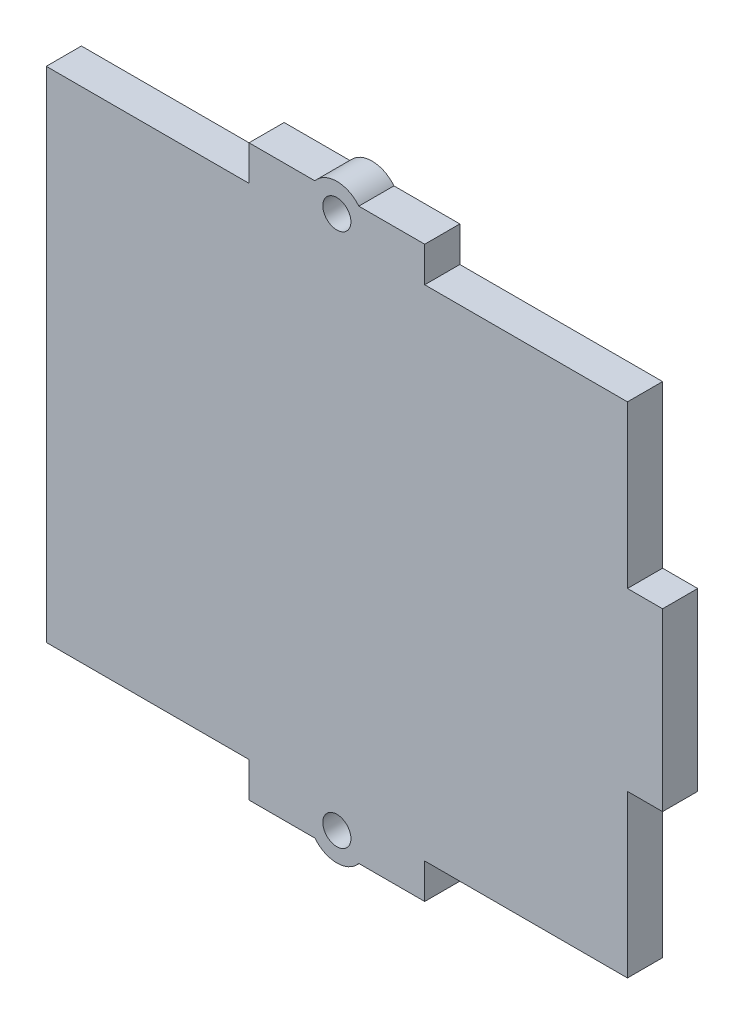
ISO-10303-21;
HEADER;
FILE_DESCRIPTION(('STEP AP214'),'2;1');
FILE_NAME('part.step','',(''),(''),'','','');
FILE_SCHEMA(('AUTOMOTIVE_DESIGN { 1 0 10303 214 1 1 1 1 }'));
ENDSEC;
DATA;
#1=APPLICATION_CONTEXT('core data for automotive mechanical design processes');
#2=APPLICATION_PROTOCOL_DEFINITION('international standard','automotive_design',2000,#1);
#3=PRODUCT_CONTEXT('',#1,'mechanical');
#4=PRODUCT('Part','Part','',(#3));
#5=PRODUCT_RELATED_PRODUCT_CATEGORY('part','',(#4));
#6=PRODUCT_DEFINITION_FORMATION('','',#4);
#7=PRODUCT_DEFINITION_CONTEXT('part definition',#1,'design');
#8=PRODUCT_DEFINITION('design','',#6,#7);
#9=PRODUCT_DEFINITION_SHAPE('','',#8);
#10=(LENGTH_UNIT() NAMED_UNIT(*) SI_UNIT(.MILLI.,.METRE.));
#11=(NAMED_UNIT(*) PLANE_ANGLE_UNIT() SI_UNIT($,.RADIAN.));
#12=(NAMED_UNIT(*) SI_UNIT($,.STERADIAN.) SOLID_ANGLE_UNIT());
#13=UNCERTAINTY_MEASURE_WITH_UNIT(LENGTH_MEASURE(1.E-05),#10,'distance_accuracy_value','');
#14=(GEOMETRIC_REPRESENTATION_CONTEXT(3) GLOBAL_UNCERTAINTY_ASSIGNED_CONTEXT((#13)) GLOBAL_UNIT_ASSIGNED_CONTEXT((#10,
#11,#12)) REPRESENTATION_CONTEXT('',''));
#15=CARTESIAN_POINT('',(0.,0.,0.));
#16=DIRECTION('',(0.,0.,1.));
#17=DIRECTION('',(1.,0.,0.));
#18=AXIS2_PLACEMENT_3D('',#15,#16,#17);
#19=CARTESIAN_POINT('',(12.5,-40.5,0.));
#20=DIRECTION('',(0.,-1.,0.));
#21=DIRECTION('',(0.,0.,-1.));
#22=AXIS2_PLACEMENT_3D('',#19,#20,#21);
#23=PLANE('',#22);
#24=DIRECTION('',(0.,0.,1.));
#25=VECTOR('',#24,1.);
#26=CARTESIAN_POINT('',(3.1224989991992,-40.5,0.));
#27=LINE('',#26,#25);
#28=CARTESIAN_POINT('',(3.1224989991992,-40.5,0.));
#29=VERTEX_POINT('',#28);
#30=CARTESIAN_POINT('',(3.1224989991992,-40.5,5.));
#31=VERTEX_POINT('',#30);
#32=EDGE_CURVE('E11',#29,#31,#27,.T.);
#33=ORIENTED_EDGE('',*,*,#32,.F.);
#34=DIRECTION('',(1.,0.,0.));
#35=VECTOR('',#34,1.);
#36=CARTESIAN_POINT('',(12.5,-40.5,0.));
#37=LINE('',#36,#35);
#38=CARTESIAN_POINT('',(12.5,-40.5,0.));
#39=VERTEX_POINT('',#38);
#40=EDGE_CURVE('E335',#29,#39,#37,.T.);
#41=ORIENTED_EDGE('',*,*,#40,.T.);
#42=DIRECTION('',(0.,0.,1.));
#43=VECTOR('',#42,1.);
#44=CARTESIAN_POINT('',(12.5,-40.5,0.));
#45=LINE('',#44,#43);
#46=CARTESIAN_POINT('',(12.5,-40.5,5.));
#47=VERTEX_POINT('',#46);
#48=EDGE_CURVE('E195',#39,#47,#45,.T.);
#49=ORIENTED_EDGE('',*,*,#48,.T.);
#50=DIRECTION('',(1.,0.,0.));
#51=VECTOR('',#50,1.);
#52=CARTESIAN_POINT('',(12.5,-40.5,5.));
#53=LINE('',#52,#51);
#54=EDGE_CURVE('E188',#31,#47,#53,.T.);
#55=ORIENTED_EDGE('',*,*,#54,.F.);
#56=EDGE_LOOP('',(#33,#41,#49,#55));
#57=FACE_BOUND('',#56,.T.);
#58=ADVANCED_FACE('F34',(#57),#23,.T.);
#59=CARTESIAN_POINT('',(-12.5,40.5,0.));
#60=DIRECTION('',(0.,1.,0.));
#61=DIRECTION('',(-1.,0.,0.));
#62=AXIS2_PLACEMENT_3D('',#59,#60,#61);
#63=PLANE('',#62);
#64=DIRECTION('',(0.,0.,1.));
#65=VECTOR('',#64,1.);
#66=CARTESIAN_POINT('',(-3.12249899919921,40.5,0.));
#67=LINE('',#66,#65);
#68=CARTESIAN_POINT('',(-3.12249899919921,40.5,0.));
#69=VERTEX_POINT('',#68);
#70=CARTESIAN_POINT('',(-3.12249899919921,40.5,5.));
#71=VERTEX_POINT('',#70);
#72=EDGE_CURVE('E181',#69,#71,#67,.T.);
#73=ORIENTED_EDGE('',*,*,#72,.F.);
#74=DIRECTION('',(-1.,0.,0.));
#75=VECTOR('',#74,1.);
#76=CARTESIAN_POINT('',(-12.5,40.5,0.));
#77=LINE('',#76,#75);
#78=CARTESIAN_POINT('',(-12.5,40.5,0.));
#79=VERTEX_POINT('',#78);
#80=EDGE_CURVE('E238',#69,#79,#77,.T.);
#81=ORIENTED_EDGE('',*,*,#80,.T.);
#82=DIRECTION('',(0.,0.,1.));
#83=VECTOR('',#82,1.);
#84=CARTESIAN_POINT('',(-12.5,40.5,0.));
#85=LINE('',#84,#83);
#86=CARTESIAN_POINT('',(-12.5,40.5,5.));
#87=VERTEX_POINT('',#86);
#88=EDGE_CURVE('E250',#79,#87,#85,.T.);
#89=ORIENTED_EDGE('',*,*,#88,.T.);
#90=DIRECTION('',(-1.,0.,0.));
#91=VECTOR('',#90,1.);
#92=CARTESIAN_POINT('',(-12.5,40.5,5.));
#93=LINE('',#92,#91);
#94=EDGE_CURVE('E248',#71,#87,#93,.T.);
#95=ORIENTED_EDGE('',*,*,#94,.F.);
#96=EDGE_LOOP('',(#73,#81,#89,#95));
#97=FACE_BOUND('',#96,.T.);
#98=ADVANCED_FACE('F311',(#97),#63,.T.);
#99=CARTESIAN_POINT('',(-41.35,-35.5,5.));
#100=DIRECTION('',(0.,1.,0.));
#101=DIRECTION('',(0.,0.,1.));
#102=AXIS2_PLACEMENT_3D('',#99,#100,#101);
#103=PLANE('',#102);
#104=DIRECTION('',(0.,0.,1.));
#105=VECTOR('',#104,1.);
#106=CARTESIAN_POINT('',(12.5,-35.5,0.));
#107=LINE('',#106,#105);
#108=CARTESIAN_POINT('',(12.5,-35.5,0.));
#109=VERTEX_POINT('',#108);
#110=CARTESIAN_POINT('',(12.5,-35.5,5.));
#111=VERTEX_POINT('',#110);
#112=EDGE_CURVE('E204',#109,#111,#107,.T.);
#113=ORIENTED_EDGE('',*,*,#112,.F.);
#114=DIRECTION('',(1.,0.,0.));
#115=VECTOR('',#114,1.);
#116=CARTESIAN_POINT('',(-41.35,-35.5,0.));
#117=LINE('',#116,#115);
#118=CARTESIAN_POINT('',(41.35,-35.5,0.));
#119=VERTEX_POINT('',#118);
#120=EDGE_CURVE('E278',#109,#119,#117,.T.);
#121=ORIENTED_EDGE('',*,*,#120,.T.);
#122=DIRECTION('',(0.,0.,-1.));
#123=VECTOR('',#122,1.);
#124=CARTESIAN_POINT('',(41.35,-35.5,5.));
#125=LINE('',#124,#123);
#126=CARTESIAN_POINT('',(41.35,-35.5,5.));
#127=VERTEX_POINT('',#126);
#128=EDGE_CURVE('E294',#127,#119,#125,.T.);
#129=ORIENTED_EDGE('',*,*,#128,.F.);
#130=DIRECTION('',(1.,0.,0.));
#131=VECTOR('',#130,1.);
#132=CARTESIAN_POINT('',(-41.35,-35.5,5.));
#133=LINE('',#132,#131);
#134=EDGE_CURVE('E263',#111,#127,#133,.T.);
#135=ORIENTED_EDGE('',*,*,#134,.F.);
#136=EDGE_LOOP('',(#113,#121,#129,#135));
#137=FACE_BOUND('',#136,.T.);
#138=ADVANCED_FACE('F369',(#137),#103,.F.);
#139=CARTESIAN_POINT('',(41.35,35.5,5.));
#140=DIRECTION('',(-1.,0.,0.));
#141=DIRECTION('',(0.,-1.,0.));
#142=AXIS2_PLACEMENT_3D('',#139,#140,#141);
#143=PLANE('',#142);
#144=DIRECTION('',(0.,0.,1.));
#145=VECTOR('',#144,1.);
#146=CARTESIAN_POINT('',(41.35,12.5,0.));
#147=LINE('',#146,#145);
#148=CARTESIAN_POINT('',(41.35,12.5,0.));
#149=VERTEX_POINT('',#148);
#150=CARTESIAN_POINT('',(41.35,12.5,5.));
#151=VERTEX_POINT('',#150);
#152=EDGE_CURVE('E223',#149,#151,#147,.T.);
#153=ORIENTED_EDGE('',*,*,#152,.F.);
#154=DIRECTION('',(0.,1.,0.));
#155=VECTOR('',#154,1.);
#156=CARTESIAN_POINT('',(41.35,35.5,0.));
#157=LINE('',#156,#155);
#158=CARTESIAN_POINT('',(41.35,35.5,0.));
#159=VERTEX_POINT('',#158);
#160=EDGE_CURVE('E282',#149,#159,#157,.T.);
#161=ORIENTED_EDGE('',*,*,#160,.T.);
#162=DIRECTION('',(0.,0.,-1.));
#163=VECTOR('',#162,1.);
#164=CARTESIAN_POINT('',(41.35,35.5,5.));
#165=LINE('',#164,#163);
#166=CARTESIAN_POINT('',(41.35,35.5,5.));
#167=VERTEX_POINT('',#166);
#168=EDGE_CURVE('E291',#167,#159,#165,.T.);
#169=ORIENTED_EDGE('',*,*,#168,.F.);
#170=DIRECTION('',(0.,1.,0.));
#171=VECTOR('',#170,1.);
#172=CARTESIAN_POINT('',(41.35,35.5,5.));
#173=LINE('',#172,#171);
#174=EDGE_CURVE('E267',#151,#167,#173,.T.);
#175=ORIENTED_EDGE('',*,*,#174,.F.);
#176=EDGE_LOOP('',(#153,#161,#169,#175));
#177=FACE_BOUND('',#176,.T.);
#178=ADVANCED_FACE('F389',(#177),#143,.F.);
#179=CARTESIAN_POINT('',(-41.35,35.5,5.));
#180=DIRECTION('',(0.,-1.,0.));
#181=DIRECTION('',(1.,0.,0.));
#182=AXIS2_PLACEMENT_3D('',#179,#180,#181);
#183=PLANE('',#182);
#184=DIRECTION('',(0.,0.,1.));
#185=VECTOR('',#184,1.);
#186=CARTESIAN_POINT('',(-12.5,35.5,0.));
#187=LINE('',#186,#185);
#188=CARTESIAN_POINT('',(-12.5,35.5,0.));
#189=VERTEX_POINT('',#188);
#190=CARTESIAN_POINT('',(-12.5,35.5,5.));
#191=VERTEX_POINT('',#190);
#192=EDGE_CURVE('E242',#189,#191,#187,.T.);
#193=ORIENTED_EDGE('',*,*,#192,.F.);
#194=DIRECTION('',(-1.,0.,0.));
#195=VECTOR('',#194,1.);
#196=CARTESIAN_POINT('',(-41.35,35.5,0.));
#197=LINE('',#196,#195);
#198=CARTESIAN_POINT('',(-41.35,35.5,0.));
#199=VERTEX_POINT('',#198);
#200=EDGE_CURVE('E286',#189,#199,#197,.T.);
#201=ORIENTED_EDGE('',*,*,#200,.T.);
#202=DIRECTION('',(0.,0.,-1.));
#203=VECTOR('',#202,1.);
#204=CARTESIAN_POINT('',(-41.35,35.5,5.));
#205=LINE('',#204,#203);
#206=CARTESIAN_POINT('',(-41.35,35.5,5.));
#207=VERTEX_POINT('',#206);
#208=EDGE_CURVE('E275',#207,#199,#205,.T.);
#209=ORIENTED_EDGE('',*,*,#208,.F.);
#210=DIRECTION('',(-1.,0.,0.));
#211=VECTOR('',#210,1.);
#212=CARTESIAN_POINT('',(-41.35,35.5,5.));
#213=LINE('',#212,#211);
#214=EDGE_CURVE('E271',#191,#207,#213,.T.);
#215=ORIENTED_EDGE('',*,*,#214,.F.);
#216=EDGE_LOOP('',(#193,#201,#209,#215));
#217=FACE_BOUND('',#216,.T.);
#218=ADVANCED_FACE('F319',(#217),#183,.F.);
#219=CARTESIAN_POINT('',(-41.35,35.5,5.));
#220=DIRECTION('',(1.,0.,0.));
#221=DIRECTION('',(0.,1.,0.));
#222=AXIS2_PLACEMENT_3D('',#219,#220,#221);
#223=PLANE('',#222);
#224=DIRECTION('',(0.,-1.,0.));
#225=VECTOR('',#224,1.);
#226=CARTESIAN_POINT('',(-41.35,35.5,0.));
#227=LINE('',#226,#225);
#228=CARTESIAN_POINT('',(-41.35,-35.5,0.));
#229=VERTEX_POINT('',#228);
#230=EDGE_CURVE('E253',#199,#229,#227,.T.);
#231=ORIENTED_EDGE('',*,*,#230,.T.);
#232=DIRECTION('',(0.,0.,-1.));
#233=VECTOR('',#232,1.);
#234=CARTESIAN_POINT('',(-41.35,-35.5,5.));
#235=LINE('',#234,#233);
#236=CARTESIAN_POINT('',(-41.35,-35.5,5.));
#237=VERTEX_POINT('',#236);
#238=EDGE_CURVE('E297',#237,#229,#235,.T.);
#239=ORIENTED_EDGE('',*,*,#238,.F.);
#240=DIRECTION('',(0.,-1.,0.));
#241=VECTOR('',#240,1.);
#242=CARTESIAN_POINT('',(-41.35,35.5,5.));
#243=LINE('',#242,#241);
#244=EDGE_CURVE('E260',#207,#237,#243,.T.);
#245=ORIENTED_EDGE('',*,*,#244,.F.);
#246=ORIENTED_EDGE('',*,*,#208,.T.);
#247=EDGE_LOOP('',(#231,#239,#245,#246));
#248=FACE_BOUND('',#247,.T.);
#249=ADVANCED_FACE('F36',(#248),#223,.F.);
#250=CARTESIAN_POINT('',(-12.5,-35.5,0.));
#251=VERTEX_POINT('',#250);
#252=EDGE_CURVE('E279',#229,#251,#117,.T.);
#253=ORIENTED_EDGE('',*,*,#252,.T.);
#254=DIRECTION('',(0.,0.,1.));
#255=VECTOR('',#254,1.);
#256=CARTESIAN_POINT('',(-12.5,-35.5,0.));
#257=LINE('',#256,#255);
#258=CARTESIAN_POINT('',(-12.5,-35.5,5.));
#259=VERTEX_POINT('',#258);
#260=EDGE_CURVE('E201',#251,#259,#257,.T.);
#261=ORIENTED_EDGE('',*,*,#260,.T.);
#262=EDGE_CURVE('E265',#237,#259,#133,.T.);
#263=ORIENTED_EDGE('',*,*,#262,.F.);
#264=ORIENTED_EDGE('',*,*,#238,.T.);
#265=EDGE_LOOP('',(#253,#261,#263,#264));
#266=FACE_BOUND('',#265,.T.);
#267=ADVANCED_FACE('F326',(#266),#103,.F.);
#268=CARTESIAN_POINT('',(41.35,-12.5,0.));
#269=VERTEX_POINT('',#268);
#270=EDGE_CURVE('E283',#119,#269,#157,.T.);
#271=ORIENTED_EDGE('',*,*,#270,.T.);
#272=DIRECTION('',(0.,0.,1.));
#273=VECTOR('',#272,1.);
#274=CARTESIAN_POINT('',(41.35,-12.5,0.));
#275=LINE('',#274,#273);
#276=CARTESIAN_POINT('',(41.35,-12.5,5.));
#277=VERTEX_POINT('',#276);
#278=EDGE_CURVE('E215',#269,#277,#275,.T.);
#279=ORIENTED_EDGE('',*,*,#278,.T.);
#280=EDGE_CURVE('E268',#127,#277,#173,.T.);
#281=ORIENTED_EDGE('',*,*,#280,.F.);
#282=ORIENTED_EDGE('',*,*,#128,.T.);
#283=EDGE_LOOP('',(#271,#279,#281,#282));
#284=FACE_BOUND('',#283,.T.);
#285=ADVANCED_FACE('F373',(#284),#143,.F.);
#286=CARTESIAN_POINT('',(12.5,35.5,0.));
#287=VERTEX_POINT('',#286);
#288=EDGE_CURVE('E264',#159,#287,#197,.T.);
#289=ORIENTED_EDGE('',*,*,#288,.T.);
#290=DIRECTION('',(0.,0.,1.));
#291=VECTOR('',#290,1.);
#292=CARTESIAN_POINT('',(12.5,35.5,0.));
#293=LINE('',#292,#291);
#294=CARTESIAN_POINT('',(12.5,35.5,5.));
#295=VERTEX_POINT('',#294);
#296=EDGE_CURVE('E256',#287,#295,#293,.T.);
#297=ORIENTED_EDGE('',*,*,#296,.T.);
#298=EDGE_CURVE('E272',#167,#295,#213,.T.);
#299=ORIENTED_EDGE('',*,*,#298,.F.);
#300=ORIENTED_EDGE('',*,*,#168,.T.);
#301=EDGE_LOOP('',(#289,#297,#299,#300));
#302=FACE_BOUND('',#301,.T.);
#303=ADVANCED_FACE('F395',(#302),#183,.F.);
#304=CARTESIAN_POINT('',(0.,0.,5.));
#305=DIRECTION('',(0.,0.,1.));
#306=DIRECTION('',(1.,0.,0.));
#307=AXIS2_PLACEMENT_3D('',#304,#305,#306);
#308=PLANE('',#307);
#309=CARTESIAN_POINT('',(-12.5,-40.5,5.));
#310=VERTEX_POINT('',#309);
#311=CARTESIAN_POINT('',(-3.1224989991992,-40.5,5.));
#312=VERTEX_POINT('',#311);
#313=EDGE_CURVE('E178',#310,#312,#53,.T.);
#314=ORIENTED_EDGE('',*,*,#313,.T.);
#315=CARTESIAN_POINT('',(0.,-38.,5.));
#316=DIRECTION('',(0.,0.,1.));
#317=DIRECTION('',(1.,0.,0.));
#318=AXIS2_PLACEMENT_3D('',#315,#316,#317);
#319=CIRCLE('',#318,4.);
#320=EDGE_CURVE('E49',#312,#31,#319,.T.);
#321=ORIENTED_EDGE('',*,*,#320,.T.);
#322=ORIENTED_EDGE('',*,*,#54,.T.);
#323=DIRECTION('',(0.,1.,0.));
#324=VECTOR('',#323,1.);
#325=CARTESIAN_POINT('',(12.5,-35.5,5.));
#326=LINE('',#325,#324);
#327=EDGE_CURVE('E339',#47,#111,#326,.T.);
#328=ORIENTED_EDGE('',*,*,#327,.T.);
#329=ORIENTED_EDGE('',*,*,#134,.T.);
#330=ORIENTED_EDGE('',*,*,#280,.T.);
#331=DIRECTION('',(1.,0.,0.));
#332=VECTOR('',#331,1.);
#333=CARTESIAN_POINT('',(46.35,-12.5,5.));
#334=LINE('',#333,#332);
#335=CARTESIAN_POINT('',(46.35,-12.5,5.));
#336=VERTEX_POINT('',#335);
#337=EDGE_CURVE('E198',#277,#336,#334,.T.);
#338=ORIENTED_EDGE('',*,*,#337,.T.);
#339=DIRECTION('',(0.,1.,0.));
#340=VECTOR('',#339,1.);
#341=CARTESIAN_POINT('',(46.35,12.5,5.));
#342=LINE('',#341,#340);
#343=CARTESIAN_POINT('',(46.35,12.5,5.));
#344=VERTEX_POINT('',#343);
#345=EDGE_CURVE('E218',#336,#344,#342,.T.);
#346=ORIENTED_EDGE('',*,*,#345,.T.);
#347=DIRECTION('',(-1.,0.,0.));
#348=VECTOR('',#347,1.);
#349=CARTESIAN_POINT('',(41.35,12.5,5.));
#350=LINE('',#349,#348);
#351=EDGE_CURVE('E210',#344,#151,#350,.T.);
#352=ORIENTED_EDGE('',*,*,#351,.T.);
#353=ORIENTED_EDGE('',*,*,#174,.T.);
#354=ORIENTED_EDGE('',*,*,#298,.T.);
#355=DIRECTION('',(0.,1.,0.));
#356=VECTOR('',#355,1.);
#357=CARTESIAN_POINT('',(12.5,35.5,5.));
#358=LINE('',#357,#356);
#359=CARTESIAN_POINT('',(12.5,40.5,5.));
#360=VERTEX_POINT('',#359);
#361=EDGE_CURVE('E245',#295,#360,#358,.T.);
#362=ORIENTED_EDGE('',*,*,#361,.T.);
#363=CARTESIAN_POINT('',(3.12249899919919,40.5,5.));
#364=VERTEX_POINT('',#363);
#365=EDGE_CURVE('E235',#360,#364,#93,.T.);
#366=ORIENTED_EDGE('',*,*,#365,.T.);
#367=CARTESIAN_POINT('',(0.,38.,5.));
#368=DIRECTION('',(0.,0.,1.));
#369=DIRECTION('',(1.,0.,0.));
#370=AXIS2_PLACEMENT_3D('',#367,#368,#369);
#371=CIRCLE('',#370,4.);
#372=EDGE_CURVE('E55',#364,#71,#371,.T.);
#373=ORIENTED_EDGE('',*,*,#372,.T.);
#374=ORIENTED_EDGE('',*,*,#94,.T.);
#375=DIRECTION('',(0.,-1.,0.));
#376=VECTOR('',#375,1.);
#377=CARTESIAN_POINT('',(-12.5,35.5,5.));
#378=LINE('',#377,#376);
#379=EDGE_CURVE('E225',#87,#191,#378,.T.);
#380=ORIENTED_EDGE('',*,*,#379,.T.);
#381=ORIENTED_EDGE('',*,*,#214,.T.);
#382=ORIENTED_EDGE('',*,*,#244,.T.);
#383=ORIENTED_EDGE('',*,*,#262,.T.);
#384=DIRECTION('',(0.,-1.,0.));
#385=VECTOR('',#384,1.);
#386=CARTESIAN_POINT('',(-12.5,-35.5,5.));
#387=LINE('',#386,#385);
#388=EDGE_CURVE('E186',#259,#310,#387,.T.);
#389=ORIENTED_EDGE('',*,*,#388,.T.);
#390=EDGE_LOOP('',(#314,#321,#322,#328,#329,#330,#338,#346,#352,#353,#354,#362,#366,#373,#374,
#380,#381,#382,#383,#389));
#391=FACE_BOUND('',#390,.T.);
#392=CARTESIAN_POINT('',(0.,38.,5.));
#393=DIRECTION('',(0.,0.,1.));
#394=DIRECTION('',(1.,0.,0.));
#395=AXIS2_PLACEMENT_3D('',#392,#393,#394);
#396=CIRCLE('',#395,2.);
#397=CARTESIAN_POINT('',(1.99999999999999,38.,5.));
#398=VERTEX_POINT('',#397);
#399=EDGE_CURVE('E345',#398,#398,#396,.T.);
#400=ORIENTED_EDGE('',*,*,#399,.F.);
#401=EDGE_LOOP('',(#400));
#402=FACE_BOUND('',#401,.T.);
#403=CARTESIAN_POINT('',(0.,-38.,5.));
#404=DIRECTION('',(0.,0.,1.));
#405=DIRECTION('',(1.,0.,0.));
#406=AXIS2_PLACEMENT_3D('',#403,#404,#405);
#407=CIRCLE('',#406,2.);
#408=CARTESIAN_POINT('',(2.,-38.,5.));
#409=VERTEX_POINT('',#408);
#410=EDGE_CURVE('E355',#409,#409,#407,.T.);
#411=ORIENTED_EDGE('',*,*,#410,.F.);
#412=EDGE_LOOP('',(#411));
#413=FACE_BOUND('',#412,.T.);
#414=ADVANCED_FACE('F183',(#391,#402,#413),#308,.T.);
#415=CARTESIAN_POINT('',(0.,0.,0.));
#416=DIRECTION('',(0.,0.,1.));
#417=DIRECTION('',(1.,0.,0.));
#418=AXIS2_PLACEMENT_3D('',#415,#416,#417);
#419=PLANE('',#418);
#420=ORIENTED_EDGE('',*,*,#40,.F.);
#421=CARTESIAN_POINT('',(0.,-38.,0.));
#422=DIRECTION('',(0.,0.,1.));
#423=DIRECTION('',(1.,0.,0.));
#424=AXIS2_PLACEMENT_3D('',#421,#422,#423);
#425=CIRCLE('',#424,4.);
#426=CARTESIAN_POINT('',(-3.1224989991992,-40.5,0.));
#427=VERTEX_POINT('',#426);
#428=EDGE_CURVE('E172',#427,#29,#425,.T.);
#429=ORIENTED_EDGE('',*,*,#428,.F.);
#430=CARTESIAN_POINT('',(-12.5,-40.5,0.));
#431=VERTEX_POINT('',#430);
#432=EDGE_CURVE('E180',#431,#427,#37,.T.);
#433=ORIENTED_EDGE('',*,*,#432,.F.);
#434=DIRECTION('',(0.,-1.,0.));
#435=VECTOR('',#434,1.);
#436=CARTESIAN_POINT('',(-12.5,-35.5,0.));
#437=LINE('',#436,#435);
#438=EDGE_CURVE('E190',#251,#431,#437,.T.);
#439=ORIENTED_EDGE('',*,*,#438,.F.);
#440=ORIENTED_EDGE('',*,*,#252,.F.);
#441=ORIENTED_EDGE('',*,*,#230,.F.);
#442=ORIENTED_EDGE('',*,*,#200,.F.);
#443=DIRECTION('',(0.,-1.,0.));
#444=VECTOR('',#443,1.);
#445=CARTESIAN_POINT('',(-12.5,35.5,0.));
#446=LINE('',#445,#444);
#447=EDGE_CURVE('E232',#79,#189,#446,.T.);
#448=ORIENTED_EDGE('',*,*,#447,.F.);
#449=ORIENTED_EDGE('',*,*,#80,.F.);
#450=CARTESIAN_POINT('',(0.,38.,0.));
#451=DIRECTION('',(0.,0.,1.));
#452=DIRECTION('',(1.,0.,0.));
#453=AXIS2_PLACEMENT_3D('',#450,#451,#452);
#454=CIRCLE('',#453,4.);
#455=CARTESIAN_POINT('',(3.12249899919919,40.5,0.));
#456=VERTEX_POINT('',#455);
#457=EDGE_CURVE('E308',#456,#69,#454,.T.);
#458=ORIENTED_EDGE('',*,*,#457,.F.);
#459=CARTESIAN_POINT('',(12.5,40.5,0.));
#460=VERTEX_POINT('',#459);
#461=EDGE_CURVE('E239',#460,#456,#77,.T.);
#462=ORIENTED_EDGE('',*,*,#461,.F.);
#463=DIRECTION('',(0.,1.,0.));
#464=VECTOR('',#463,1.);
#465=CARTESIAN_POINT('',(12.5,35.5,0.));
#466=LINE('',#465,#464);
#467=EDGE_CURVE('E234',#287,#460,#466,.T.);
#468=ORIENTED_EDGE('',*,*,#467,.F.);
#469=ORIENTED_EDGE('',*,*,#288,.F.);
#470=ORIENTED_EDGE('',*,*,#160,.F.);
#471=DIRECTION('',(-1.,0.,0.));
#472=VECTOR('',#471,1.);
#473=CARTESIAN_POINT('',(41.35,12.5,0.));
#474=LINE('',#473,#472);
#475=CARTESIAN_POINT('',(46.35,12.5,0.));
#476=VERTEX_POINT('',#475);
#477=EDGE_CURVE('E213',#476,#149,#474,.T.);
#478=ORIENTED_EDGE('',*,*,#477,.F.);
#479=DIRECTION('',(0.,1.,0.));
#480=VECTOR('',#479,1.);
#481=CARTESIAN_POINT('',(46.35,12.5,0.));
#482=LINE('',#481,#480);
#483=CARTESIAN_POINT('',(46.35,-12.5,0.));
#484=VERTEX_POINT('',#483);
#485=EDGE_CURVE('E209',#484,#476,#482,.T.);
#486=ORIENTED_EDGE('',*,*,#485,.F.);
#487=DIRECTION('',(1.,0.,0.));
#488=VECTOR('',#487,1.);
#489=CARTESIAN_POINT('',(46.35,-12.5,0.));
#490=LINE('',#489,#488);
#491=EDGE_CURVE('E206',#269,#484,#490,.T.);
#492=ORIENTED_EDGE('',*,*,#491,.F.);
#493=ORIENTED_EDGE('',*,*,#270,.F.);
#494=ORIENTED_EDGE('',*,*,#120,.F.);
#495=DIRECTION('',(0.,1.,0.));
#496=VECTOR('',#495,1.);
#497=CARTESIAN_POINT('',(12.5,-35.5,0.));
#498=LINE('',#497,#496);
#499=EDGE_CURVE('E187',#39,#109,#498,.T.);
#500=ORIENTED_EDGE('',*,*,#499,.F.);
#501=EDGE_LOOP('',(#420,#429,#433,#439,#440,#441,#442,#448,#449,#458,#462,#468,#469,#470,#478,
#486,#492,#493,#494,#500));
#502=FACE_BOUND('',#501,.T.);
#503=CARTESIAN_POINT('',(0.,38.,0.));
#504=DIRECTION('',(0.,0.,1.));
#505=DIRECTION('',(1.,0.,0.));
#506=AXIS2_PLACEMENT_3D('',#503,#504,#505);
#507=CIRCLE('',#506,2.);
#508=CARTESIAN_POINT('',(1.99999999999999,38.,0.));
#509=VERTEX_POINT('',#508);
#510=EDGE_CURVE('E341',#509,#509,#507,.T.);
#511=ORIENTED_EDGE('',*,*,#510,.T.);
#512=EDGE_LOOP('',(#511));
#513=FACE_BOUND('',#512,.T.);
#514=CARTESIAN_POINT('',(0.,-38.,0.));
#515=DIRECTION('',(0.,0.,1.));
#516=DIRECTION('',(1.,0.,0.));
#517=AXIS2_PLACEMENT_3D('',#514,#515,#516);
#518=CIRCLE('',#517,2.);
#519=CARTESIAN_POINT('',(2.,-38.,0.));
#520=VERTEX_POINT('',#519);
#521=EDGE_CURVE('E349',#520,#520,#518,.T.);
#522=ORIENTED_EDGE('',*,*,#521,.T.);
#523=EDGE_LOOP('',(#522));
#524=FACE_BOUND('',#523,.T.);
#525=ADVANCED_FACE('F333',(#502,#513,#524),#419,.F.);
#526=CARTESIAN_POINT('',(-12.5,35.5,0.));
#527=DIRECTION('',(-1.,0.,0.));
#528=DIRECTION('',(0.,0.,1.));
#529=AXIS2_PLACEMENT_3D('',#526,#527,#528);
#530=PLANE('',#529);
#531=ORIENTED_EDGE('',*,*,#379,.F.);
#532=ORIENTED_EDGE('',*,*,#88,.F.);
#533=ORIENTED_EDGE('',*,*,#447,.T.);
#534=ORIENTED_EDGE('',*,*,#192,.T.);
#535=EDGE_LOOP('',(#531,#532,#533,#534));
#536=FACE_BOUND('',#535,.T.);
#537=ADVANCED_FACE('F402',(#536),#530,.T.);
#538=DIRECTION('',(0.,0.,1.));
#539=VECTOR('',#538,1.);
#540=CARTESIAN_POINT('',(3.12249899919919,40.5,0.));
#541=LINE('',#540,#539);
#542=EDGE_CURVE('E300',#364,#456,#541,.F.);
#543=ORIENTED_EDGE('',*,*,#542,.F.);
#544=ORIENTED_EDGE('',*,*,#365,.F.);
#545=DIRECTION('',(0.,0.,1.));
#546=VECTOR('',#545,1.);
#547=CARTESIAN_POINT('',(12.5,40.5,0.));
#548=LINE('',#547,#546);
#549=EDGE_CURVE('E254',#460,#360,#548,.T.);
#550=ORIENTED_EDGE('',*,*,#549,.F.);
#551=ORIENTED_EDGE('',*,*,#461,.T.);
#552=EDGE_LOOP('',(#543,#544,#550,#551));
#553=FACE_BOUND('',#552,.T.);
#554=ADVANCED_FACE('F400',(#553),#63,.T.);
#555=CARTESIAN_POINT('',(12.5,35.5,0.));
#556=DIRECTION('',(1.,0.,0.));
#557=DIRECTION('',(0.,0.,-1.));
#558=AXIS2_PLACEMENT_3D('',#555,#556,#557);
#559=PLANE('',#558);
#560=ORIENTED_EDGE('',*,*,#361,.F.);
#561=ORIENTED_EDGE('',*,*,#296,.F.);
#562=ORIENTED_EDGE('',*,*,#467,.T.);
#563=ORIENTED_EDGE('',*,*,#549,.T.);
#564=EDGE_LOOP('',(#560,#561,#562,#563));
#565=FACE_BOUND('',#564,.T.);
#566=ADVANCED_FACE('F409',(#565),#559,.T.);
#567=CARTESIAN_POINT('',(41.35,12.5,0.));
#568=DIRECTION('',(0.,1.,0.));
#569=DIRECTION('',(0.,0.,1.));
#570=AXIS2_PLACEMENT_3D('',#567,#568,#569);
#571=PLANE('',#570);
#572=ORIENTED_EDGE('',*,*,#351,.F.);
#573=DIRECTION('',(0.,0.,1.));
#574=VECTOR('',#573,1.);
#575=CARTESIAN_POINT('',(46.35,12.5,0.));
#576=LINE('',#575,#574);
#577=EDGE_CURVE('E226',#476,#344,#576,.T.);
#578=ORIENTED_EDGE('',*,*,#577,.F.);
#579=ORIENTED_EDGE('',*,*,#477,.T.);
#580=ORIENTED_EDGE('',*,*,#152,.T.);
#581=EDGE_LOOP('',(#572,#578,#579,#580));
#582=FACE_BOUND('',#581,.T.);
#583=ADVANCED_FACE('F386',(#582),#571,.T.);
#584=CARTESIAN_POINT('',(46.35,12.5,0.));
#585=DIRECTION('',(1.,0.,0.));
#586=DIRECTION('',(0.,0.,-1.));
#587=AXIS2_PLACEMENT_3D('',#584,#585,#586);
#588=PLANE('',#587);
#589=ORIENTED_EDGE('',*,*,#345,.F.);
#590=DIRECTION('',(0.,0.,1.));
#591=VECTOR('',#590,1.);
#592=CARTESIAN_POINT('',(46.35,-12.5,0.));
#593=LINE('',#592,#591);
#594=EDGE_CURVE('E228',#484,#336,#593,.T.);
#595=ORIENTED_EDGE('',*,*,#594,.F.);
#596=ORIENTED_EDGE('',*,*,#485,.T.);
#597=ORIENTED_EDGE('',*,*,#577,.T.);
#598=EDGE_LOOP('',(#589,#595,#596,#597));
#599=FACE_BOUND('',#598,.T.);
#600=ADVANCED_FACE('F382',(#599),#588,.T.);
#601=CARTESIAN_POINT('',(46.35,-12.5,0.));
#602=DIRECTION('',(0.,-1.,0.));
#603=DIRECTION('',(0.,0.,-1.));
#604=AXIS2_PLACEMENT_3D('',#601,#602,#603);
#605=PLANE('',#604);
#606=ORIENTED_EDGE('',*,*,#337,.F.);
#607=ORIENTED_EDGE('',*,*,#278,.F.);
#608=ORIENTED_EDGE('',*,*,#491,.T.);
#609=ORIENTED_EDGE('',*,*,#594,.T.);
#610=EDGE_LOOP('',(#606,#607,#608,#609));
#611=FACE_BOUND('',#610,.T.);
#612=ADVANCED_FACE('F376',(#611),#605,.T.);
#613=CARTESIAN_POINT('',(12.5,-35.5,0.));
#614=DIRECTION('',(1.,0.,0.));
#615=DIRECTION('',(0.,0.,-1.));
#616=AXIS2_PLACEMENT_3D('',#613,#614,#615);
#617=PLANE('',#616);
#618=ORIENTED_EDGE('',*,*,#327,.F.);
#619=ORIENTED_EDGE('',*,*,#48,.F.);
#620=ORIENTED_EDGE('',*,*,#499,.T.);
#621=ORIENTED_EDGE('',*,*,#112,.T.);
#622=EDGE_LOOP('',(#618,#619,#620,#621));
#623=FACE_BOUND('',#622,.T.);
#624=ADVANCED_FACE('F367',(#623),#617,.T.);
#625=DIRECTION('',(0.,0.,1.));
#626=VECTOR('',#625,1.);
#627=CARTESIAN_POINT('',(-3.1224989991992,-40.5,0.));
#628=LINE('',#627,#626);
#629=EDGE_CURVE('E42',#312,#427,#628,.F.);
#630=ORIENTED_EDGE('',*,*,#629,.F.);
#631=ORIENTED_EDGE('',*,*,#313,.F.);
#632=DIRECTION('',(0.,0.,1.));
#633=VECTOR('',#632,1.);
#634=CARTESIAN_POINT('',(-12.5,-40.5,0.));
#635=LINE('',#634,#633);
#636=EDGE_CURVE('E199',#431,#310,#635,.T.);
#637=ORIENTED_EDGE('',*,*,#636,.F.);
#638=ORIENTED_EDGE('',*,*,#432,.T.);
#639=EDGE_LOOP('',(#630,#631,#637,#638));
#640=FACE_BOUND('',#639,.T.);
#641=ADVANCED_FACE('F177',(#640),#23,.T.);
#642=CARTESIAN_POINT('',(-12.5,-35.5,0.));
#643=DIRECTION('',(-1.,0.,0.));
#644=DIRECTION('',(0.,0.,1.));
#645=AXIS2_PLACEMENT_3D('',#642,#643,#644);
#646=PLANE('',#645);
#647=ORIENTED_EDGE('',*,*,#388,.F.);
#648=ORIENTED_EDGE('',*,*,#260,.F.);
#649=ORIENTED_EDGE('',*,*,#438,.T.);
#650=ORIENTED_EDGE('',*,*,#636,.T.);
#651=EDGE_LOOP('',(#647,#648,#649,#650));
#652=FACE_BOUND('',#651,.T.);
#653=ADVANCED_FACE('F330',(#652),#646,.T.);
#654=CARTESIAN_POINT('',(0.,-38.,0.));
#655=DIRECTION('',(0.,0.,1.));
#656=DIRECTION('',(1.,0.,0.));
#657=AXIS2_PLACEMENT_3D('',#654,#655,#656);
#658=CYLINDRICAL_SURFACE('',#657,2.);
#659=ORIENTED_EDGE('',*,*,#521,.F.);
#660=EDGE_LOOP('',(#659));
#661=FACE_BOUND('',#660,.T.);
#662=ORIENTED_EDGE('',*,*,#410,.T.);
#663=EDGE_LOOP('',(#662));
#664=FACE_BOUND('',#663,.T.);
#665=ADVANCED_FACE('F426',(#661,#664),#658,.F.);
#666=CARTESIAN_POINT('',(0.,38.,0.));
#667=DIRECTION('',(0.,0.,1.));
#668=DIRECTION('',(1.,0.,0.));
#669=AXIS2_PLACEMENT_3D('',#666,#667,#668);
#670=CYLINDRICAL_SURFACE('',#669,2.);
#671=ORIENTED_EDGE('',*,*,#510,.F.);
#672=EDGE_LOOP('',(#671));
#673=FACE_BOUND('',#672,.T.);
#674=ORIENTED_EDGE('',*,*,#399,.T.);
#675=EDGE_LOOP('',(#674));
#676=FACE_BOUND('',#675,.T.);
#677=ADVANCED_FACE('F473',(#673,#676),#670,.F.);
#678=CARTESIAN_POINT('',(0.,38.,0.));
#679=DIRECTION('',(0.,0.,1.));
#680=DIRECTION('',(1.,0.,0.));
#681=AXIS2_PLACEMENT_3D('',#678,#679,#680);
#682=CYLINDRICAL_SURFACE('',#681,4.);
#683=ORIENTED_EDGE('',*,*,#457,.T.);
#684=ORIENTED_EDGE('',*,*,#72,.T.);
#685=ORIENTED_EDGE('',*,*,#372,.F.);
#686=ORIENTED_EDGE('',*,*,#542,.T.);
#687=EDGE_LOOP('',(#683,#684,#685,#686));
#688=FACE_BOUND('',#687,.T.);
#689=ADVANCED_FACE('F305',(#688),#682,.T.);
#690=CARTESIAN_POINT('',(0.,-38.,0.));
#691=DIRECTION('',(0.,0.,1.));
#692=DIRECTION('',(1.,0.,0.));
#693=AXIS2_PLACEMENT_3D('',#690,#691,#692);
#694=CYLINDRICAL_SURFACE('',#693,4.);
#695=ORIENTED_EDGE('',*,*,#428,.T.);
#696=ORIENTED_EDGE('',*,*,#32,.T.);
#697=ORIENTED_EDGE('',*,*,#320,.F.);
#698=ORIENTED_EDGE('',*,*,#629,.T.);
#699=EDGE_LOOP('',(#695,#696,#697,#698));
#700=FACE_BOUND('',#699,.T.);
#701=ADVANCED_FACE('F168',(#700),#694,.T.);
#702=CLOSED_SHELL('',(#58,#98,#138,#178,#218,#249,#267,#285,#303,#414,#525,#537,#554,#566,#583,
#600,#612,#624,#641,#653,#665,#677,#689,#701));
#703=MANIFOLD_SOLID_BREP('B2',#702);
#704=ADVANCED_BREP_SHAPE_REPRESENTATION('',(#18,#703),#14);
#705=SHAPE_DEFINITION_REPRESENTATION(#9,#704);
ENDSEC;
END-ISO-10303-21;
